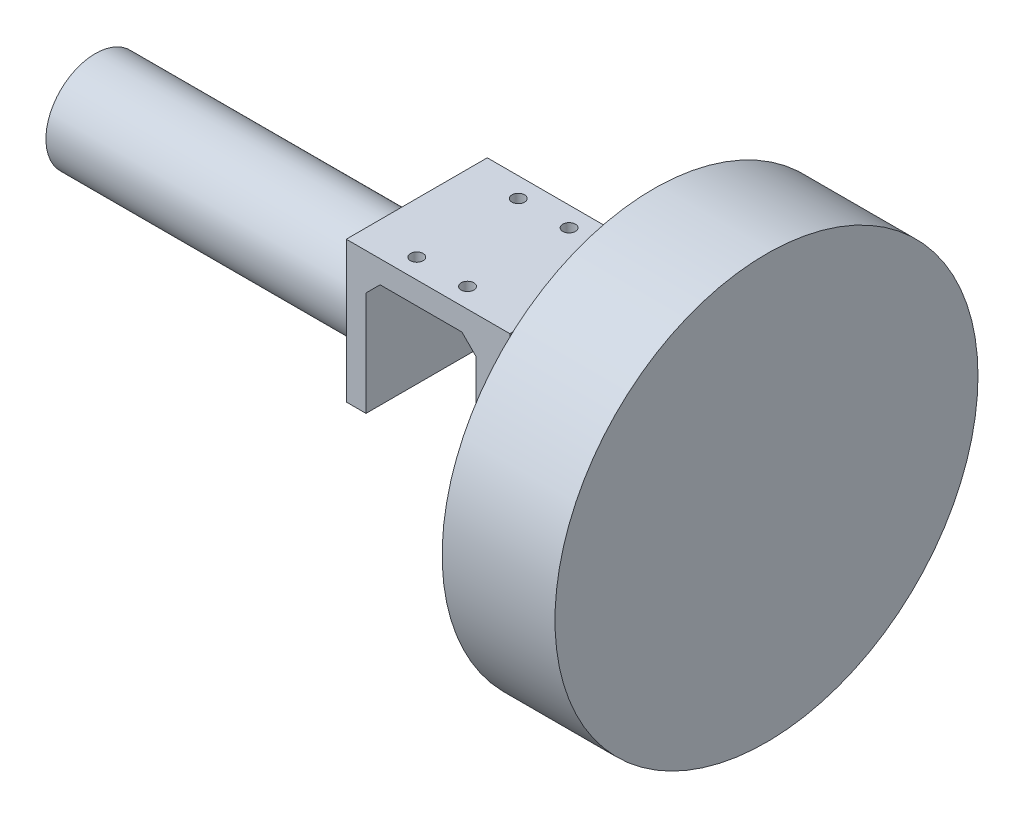
ISO-10303-21;
HEADER;
FILE_DESCRIPTION(('STEP AP214'),'2;1');
FILE_NAME('part.step','',(''),(''),'','','');
FILE_SCHEMA(('AUTOMOTIVE_DESIGN { 1 0 10303 214 1 1 1 1 }'));
ENDSEC;
DATA;
#1=APPLICATION_CONTEXT('core data for automotive mechanical design processes');
#2=APPLICATION_PROTOCOL_DEFINITION('international standard','automotive_design',2000,#1);
#3=PRODUCT_CONTEXT('',#1,'mechanical');
#4=PRODUCT('Part','Part','',(#3));
#5=PRODUCT_RELATED_PRODUCT_CATEGORY('part','',(#4));
#6=PRODUCT_DEFINITION_FORMATION('','',#4);
#7=PRODUCT_DEFINITION_CONTEXT('part definition',#1,'design');
#8=PRODUCT_DEFINITION('design','',#6,#7);
#9=PRODUCT_DEFINITION_SHAPE('','',#8);
#10=(LENGTH_UNIT() NAMED_UNIT(*) SI_UNIT(.MILLI.,.METRE.));
#11=(NAMED_UNIT(*) PLANE_ANGLE_UNIT() SI_UNIT($,.RADIAN.));
#12=(NAMED_UNIT(*) SI_UNIT($,.STERADIAN.) SOLID_ANGLE_UNIT());
#13=UNCERTAINTY_MEASURE_WITH_UNIT(LENGTH_MEASURE(1.E-05),#10,'distance_accuracy_value','');
#14=(GEOMETRIC_REPRESENTATION_CONTEXT(3) GLOBAL_UNCERTAINTY_ASSIGNED_CONTEXT((#13)) GLOBAL_UNIT_ASSIGNED_CONTEXT((#10,
#11,#12)) REPRESENTATION_CONTEXT('',''));
#15=CARTESIAN_POINT('',(0.,0.,0.));
#16=DIRECTION('',(0.,0.,1.));
#17=DIRECTION('',(1.,0.,0.));
#18=AXIS2_PLACEMENT_3D('',#15,#16,#17);
#19=CARTESIAN_POINT('',(20.,0.,0.));
#20=DIRECTION('',(-1.,0.,0.));
#21=DIRECTION('',(0.,0.,1.));
#22=AXIS2_PLACEMENT_3D('',#19,#20,#21);
#23=CYLINDRICAL_SURFACE('',#22,75.);
#24=CARTESIAN_POINT('',(20.,0.,0.));
#25=DIRECTION('',(1.,0.,0.));
#26=DIRECTION('',(0.,0.,-1.));
#27=AXIS2_PLACEMENT_3D('',#24,#25,#26);
#28=CIRCLE('',#27,75.);
#29=CARTESIAN_POINT('',(20.,0.,-75.));
#30=VERTEX_POINT('',#29);
#31=EDGE_CURVE('E169',#30,#30,#28,.T.);
#32=ORIENTED_EDGE('',*,*,#31,.F.);
#33=EDGE_LOOP('',(#32));
#34=FACE_BOUND('',#33,.T.);
#35=CARTESIAN_POINT('',(-20.,0.,0.));
#36=DIRECTION('',(1.,0.,0.));
#37=DIRECTION('',(0.,0.,-1.));
#38=AXIS2_PLACEMENT_3D('',#35,#36,#37);
#39=CIRCLE('',#38,75.);
#40=CARTESIAN_POINT('',(-20.,0.,-75.));
#41=VERTEX_POINT('',#40);
#42=EDGE_CURVE('E167',#41,#41,#39,.T.);
#43=ORIENTED_EDGE('',*,*,#42,.T.);
#44=EDGE_LOOP('',(#43));
#45=FACE_BOUND('',#44,.T.);
#46=ADVANCED_FACE('F43',(#34,#45),#23,.T.);
#47=CARTESIAN_POINT('',(20.,0.,0.));
#48=DIRECTION('',(1.,0.,0.));
#49=DIRECTION('',(0.,0.,-1.));
#50=AXIS2_PLACEMENT_3D('',#47,#48,#49);
#51=PLANE('',#50);
#52=ORIENTED_EDGE('',*,*,#31,.T.);
#53=EDGE_LOOP('',(#52));
#54=FACE_BOUND('',#53,.T.);
#55=ADVANCED_FACE('F291',(#54),#51,.T.);
#56=CARTESIAN_POINT('',(-20.,0.,0.));
#57=DIRECTION('',(1.,0.,0.));
#58=DIRECTION('',(0.,0.,-1.));
#59=AXIS2_PLACEMENT_3D('',#56,#57,#58);
#60=PLANE('',#59);
#61=CARTESIAN_POINT('',(-20.,0.,0.));
#62=DIRECTION('',(-1.,0.,0.));
#63=DIRECTION('',(0.,0.,1.));
#64=AXIS2_PLACEMENT_3D('',#61,#62,#63);
#65=CIRCLE('',#64,14.);
#66=CARTESIAN_POINT('',(-20.,0.,14.));
#67=VERTEX_POINT('',#66);
#68=EDGE_CURVE('E162',#67,#67,#65,.T.);
#69=ORIENTED_EDGE('',*,*,#68,.F.);
#70=EDGE_LOOP('',(#69));
#71=FACE_BOUND('',#70,.T.);
#72=ORIENTED_EDGE('',*,*,#42,.F.);
#73=EDGE_LOOP('',(#72));
#74=FACE_BOUND('',#73,.T.);
#75=ADVANCED_FACE('F303',(#71,#74),#60,.F.);
#76=CARTESIAN_POINT('',(-40.,0.,0.));
#77=DIRECTION('',(1.,0.,0.));
#78=DIRECTION('',(0.,0.,-1.));
#79=AXIS2_PLACEMENT_3D('',#76,#77,#78);
#80=CYLINDRICAL_SURFACE('',#79,14.);
#81=CARTESIAN_POINT('',(-40.,0.,0.));
#82=DIRECTION('',(-1.,0.,0.));
#83=DIRECTION('',(0.,0.,1.));
#84=AXIS2_PLACEMENT_3D('',#81,#82,#83);
#85=CIRCLE('',#84,14.);
#86=CARTESIAN_POINT('',(-40.,0.,14.));
#87=VERTEX_POINT('',#86);
#88=EDGE_CURVE('E152',#87,#87,#85,.T.);
#89=ORIENTED_EDGE('',*,*,#88,.F.);
#90=EDGE_LOOP('',(#89));
#91=FACE_BOUND('',#90,.T.);
#92=ORIENTED_EDGE('',*,*,#68,.T.);
#93=EDGE_LOOP('',(#92));
#94=FACE_BOUND('',#93,.T.);
#95=ADVANCED_FACE('F483',(#91,#94),#80,.T.);
#96=CARTESIAN_POINT('',(-40.,0.,0.));
#97=DIRECTION('',(-1.,0.,0.));
#98=DIRECTION('',(0.,0.,1.));
#99=AXIS2_PLACEMENT_3D('',#96,#97,#98);
#100=PLANE('',#99);
#101=CARTESIAN_POINT('',(-40.,0.,0.));
#102=DIRECTION('',(-1.,0.,0.));
#103=DIRECTION('',(0.,0.,1.));
#104=AXIS2_PLACEMENT_3D('',#101,#102,#103);
#105=CIRCLE('',#104,7.);
#106=CARTESIAN_POINT('',(-40.,0.,7.));
#107=VERTEX_POINT('',#106);
#108=EDGE_CURVE('E159',#107,#107,#105,.T.);
#109=ORIENTED_EDGE('',*,*,#108,.F.);
#110=EDGE_LOOP('',(#109));
#111=FACE_BOUND('',#110,.T.);
#112=ORIENTED_EDGE('',*,*,#88,.T.);
#113=EDGE_LOOP('',(#112));
#114=FACE_BOUND('',#113,.T.);
#115=ADVANCED_FACE('F475',(#111,#114),#100,.T.);
#116=CARTESIAN_POINT('',(-46.,0.,0.));
#117=DIRECTION('',(1.,0.,0.));
#118=DIRECTION('',(0.,0.,-1.));
#119=AXIS2_PLACEMENT_3D('',#116,#117,#118);
#120=CYLINDRICAL_SURFACE('',#119,7.);
#121=CARTESIAN_POINT('',(-46.,0.,0.));
#122=DIRECTION('',(-1.,0.,0.));
#123=DIRECTION('',(0.,0.,1.));
#124=AXIS2_PLACEMENT_3D('',#121,#122,#123);
#125=CIRCLE('',#124,7.);
#126=CARTESIAN_POINT('',(-46.,0.,7.));
#127=VERTEX_POINT('',#126);
#128=EDGE_CURVE('E149',#127,#127,#125,.T.);
#129=ORIENTED_EDGE('',*,*,#128,.F.);
#130=EDGE_LOOP('',(#129));
#131=FACE_BOUND('',#130,.T.);
#132=ORIENTED_EDGE('',*,*,#108,.T.);
#133=EDGE_LOOP('',(#132));
#134=FACE_BOUND('',#133,.T.);
#135=ADVANCED_FACE('F465',(#131,#134),#120,.T.);
#136=CARTESIAN_POINT('',(-58.,-20.,25.));
#137=DIRECTION('',(0.,1.,0.));
#138=DIRECTION('',(-1.,0.,0.));
#139=AXIS2_PLACEMENT_3D('',#136,#137,#138);
#140=PLANE('',#139);
#141=DIRECTION('',(1.,0.,0.));
#142=VECTOR('',#141,1.);
#143=CARTESIAN_POINT('',(-58.,-20.,-25.));
#144=LINE('',#143,#142);
#145=CARTESIAN_POINT('',(-58.,-20.,-25.));
#146=VERTEX_POINT('',#145);
#147=CARTESIAN_POINT('',(-46.,-20.,-25.));
#148=VERTEX_POINT('',#147);
#149=EDGE_CURVE('E147',#146,#148,#144,.T.);
#150=ORIENTED_EDGE('',*,*,#149,.T.);
#151=DIRECTION('',(0.,0.,-1.));
#152=VECTOR('',#151,1.);
#153=CARTESIAN_POINT('',(-46.,-20.,25.));
#154=LINE('',#153,#152);
#155=CARTESIAN_POINT('',(-46.,-20.,25.));
#156=VERTEX_POINT('',#155);
#157=EDGE_CURVE('E128',#156,#148,#154,.T.);
#158=ORIENTED_EDGE('',*,*,#157,.F.);
#159=DIRECTION('',(1.,0.,0.));
#160=VECTOR('',#159,1.);
#161=CARTESIAN_POINT('',(-58.,-20.,25.));
#162=LINE('',#161,#160);
#163=CARTESIAN_POINT('',(-58.,-20.,25.));
#164=VERTEX_POINT('',#163);
#165=EDGE_CURVE('E138',#164,#156,#162,.T.);
#166=ORIENTED_EDGE('',*,*,#165,.F.);
#167=DIRECTION('',(0.,0.,-1.));
#168=VECTOR('',#167,1.);
#169=CARTESIAN_POINT('',(-58.,-20.,25.));
#170=LINE('',#169,#168);
#171=EDGE_CURVE('E228',#164,#146,#170,.T.);
#172=ORIENTED_EDGE('',*,*,#171,.T.);
#173=EDGE_LOOP('',(#150,#158,#166,#172));
#174=FACE_BOUND('',#173,.T.);
#175=ADVANCED_FACE('F150',(#174),#140,.F.);
#176=CARTESIAN_POINT('',(-46.,-20.,25.));
#177=DIRECTION('',(-1.,0.,0.));
#178=DIRECTION('',(0.,0.,1.));
#179=AXIS2_PLACEMENT_3D('',#176,#177,#178);
#180=PLANE('',#179);
#181=ORIENTED_EDGE('',*,*,#128,.T.);
#182=EDGE_LOOP('',(#181));
#183=FACE_BOUND('',#182,.T.);
#184=DIRECTION('',(0.,1.,0.));
#185=VECTOR('',#184,1.);
#186=CARTESIAN_POINT('',(-46.,-20.,-25.));
#187=LINE('',#186,#185);
#188=CARTESIAN_POINT('',(-46.,30.,-25.));
#189=VERTEX_POINT('',#188);
#190=EDGE_CURVE('E227',#148,#189,#187,.T.);
#191=ORIENTED_EDGE('',*,*,#190,.T.);
#192=DIRECTION('',(0.,0.,-1.));
#193=VECTOR('',#192,1.);
#194=CARTESIAN_POINT('',(-46.,30.,25.));
#195=LINE('',#194,#193);
#196=CARTESIAN_POINT('',(-46.,30.,25.));
#197=VERTEX_POINT('',#196);
#198=EDGE_CURVE('E135',#197,#189,#195,.T.);
#199=ORIENTED_EDGE('',*,*,#198,.F.);
#200=DIRECTION('',(0.,1.,0.));
#201=VECTOR('',#200,1.);
#202=CARTESIAN_POINT('',(-46.,-20.,25.));
#203=LINE('',#202,#201);
#204=EDGE_CURVE('E124',#156,#197,#203,.T.);
#205=ORIENTED_EDGE('',*,*,#204,.F.);
#206=ORIENTED_EDGE('',*,*,#157,.T.);
#207=EDGE_LOOP('',(#191,#199,#205,#206));
#208=FACE_BOUND('',#207,.T.);
#209=ADVANCED_FACE('F130',(#183,#208),#180,.F.);
#210=CARTESIAN_POINT('',(-46.,30.,25.));
#211=DIRECTION('',(0.,-1.,0.));
#212=DIRECTION('',(1.,0.,0.));
#213=AXIS2_PLACEMENT_3D('',#210,#211,#212);
#214=PLANE('',#213);
#215=CARTESIAN_POINT('',(-68.,30.,-18.));
#216=DIRECTION('',(0.,1.,0.));
#217=DIRECTION('',(0.,0.,1.));
#218=AXIS2_PLACEMENT_3D('',#215,#216,#217);
#219=CIRCLE('',#218,2.24999999999999);
#220=CARTESIAN_POINT('',(-68.,30.,-15.75));
#221=VERTEX_POINT('',#220);
#222=EDGE_CURVE('E203',#221,#221,#219,.T.);
#223=ORIENTED_EDGE('',*,*,#222,.F.);
#224=EDGE_LOOP('',(#223));
#225=FACE_BOUND('',#224,.T.);
#226=CARTESIAN_POINT('',(-86.,30.,-18.));
#227=DIRECTION('',(0.,1.,0.));
#228=DIRECTION('',(0.,0.,1.));
#229=AXIS2_PLACEMENT_3D('',#226,#227,#228);
#230=CIRCLE('',#229,2.24999999999999);
#231=CARTESIAN_POINT('',(-86.,30.,-15.75));
#232=VERTEX_POINT('',#231);
#233=EDGE_CURVE('E192',#232,#232,#230,.T.);
#234=ORIENTED_EDGE('',*,*,#233,.F.);
#235=EDGE_LOOP('',(#234));
#236=FACE_BOUND('',#235,.T.);
#237=CARTESIAN_POINT('',(-68.,30.,18.));
#238=DIRECTION('',(0.,1.,0.));
#239=DIRECTION('',(0.,0.,1.));
#240=AXIS2_PLACEMENT_3D('',#237,#238,#239);
#241=CIRCLE('',#240,2.24999999999999);
#242=CARTESIAN_POINT('',(-68.,30.,20.25));
#243=VERTEX_POINT('',#242);
#244=EDGE_CURVE('E191',#243,#243,#241,.T.);
#245=ORIENTED_EDGE('',*,*,#244,.F.);
#246=EDGE_LOOP('',(#245));
#247=FACE_BOUND('',#246,.T.);
#248=CARTESIAN_POINT('',(-86.,30.,18.));
#249=DIRECTION('',(0.,1.,0.));
#250=DIRECTION('',(0.,0.,1.));
#251=AXIS2_PLACEMENT_3D('',#248,#249,#250);
#252=CIRCLE('',#251,2.24999999999999);
#253=CARTESIAN_POINT('',(-86.,30.,20.25));
#254=VERTEX_POINT('',#253);
#255=EDGE_CURVE('E187',#254,#254,#252,.T.);
#256=ORIENTED_EDGE('',*,*,#255,.F.);
#257=EDGE_LOOP('',(#256));
#258=FACE_BOUND('',#257,.T.);
#259=DIRECTION('',(-1.,0.,0.));
#260=VECTOR('',#259,1.);
#261=CARTESIAN_POINT('',(-46.,30.,-25.));
#262=LINE('',#261,#260);
#263=CARTESIAN_POINT('',(-104.,30.,-25.));
#264=VERTEX_POINT('',#263);
#265=EDGE_CURVE('E226',#189,#264,#262,.T.);
#266=ORIENTED_EDGE('',*,*,#265,.T.);
#267=DIRECTION('',(0.,0.,-1.));
#268=VECTOR('',#267,1.);
#269=CARTESIAN_POINT('',(-104.,30.,25.));
#270=LINE('',#269,#268);
#271=CARTESIAN_POINT('',(-104.,30.,25.));
#272=VERTEX_POINT('',#271);
#273=EDGE_CURVE('E151',#272,#264,#270,.T.);
#274=ORIENTED_EDGE('',*,*,#273,.F.);
#275=DIRECTION('',(-1.,0.,0.));
#276=VECTOR('',#275,1.);
#277=CARTESIAN_POINT('',(-46.,30.,25.));
#278=LINE('',#277,#276);
#279=EDGE_CURVE('E133',#197,#272,#278,.T.);
#280=ORIENTED_EDGE('',*,*,#279,.F.);
#281=ORIENTED_EDGE('',*,*,#198,.T.);
#282=EDGE_LOOP('',(#266,#274,#280,#281));
#283=FACE_BOUND('',#282,.T.);
#284=ADVANCED_FACE('F277',(#225,#236,#247,#258,#283),#214,.F.);
#285=CARTESIAN_POINT('',(-104.,30.,25.));
#286=DIRECTION('',(1.,0.,0.));
#287=DIRECTION('',(0.,0.,-1.));
#288=AXIS2_PLACEMENT_3D('',#285,#286,#287);
#289=PLANE('',#288);
#290=CARTESIAN_POINT('',(-104.,0.,0.));
#291=DIRECTION('',(-1.,0.,0.));
#292=DIRECTION('',(0.,0.,1.));
#293=AXIS2_PLACEMENT_3D('',#290,#291,#292);
#294=CIRCLE('',#293,17.5);
#295=CARTESIAN_POINT('',(-104.,0.,-17.5));
#296=VERTEX_POINT('',#295);
#297=EDGE_CURVE('E11',#296,#296,#294,.T.);
#298=ORIENTED_EDGE('',*,*,#297,.F.);
#299=EDGE_LOOP('',(#298));
#300=FACE_BOUND('',#299,.T.);
#301=DIRECTION('',(0.,-1.,0.));
#302=VECTOR('',#301,1.);
#303=CARTESIAN_POINT('',(-104.,30.,-25.));
#304=LINE('',#303,#302);
#305=CARTESIAN_POINT('',(-104.,-20.,-25.));
#306=VERTEX_POINT('',#305);
#307=EDGE_CURVE('E235',#264,#306,#304,.T.);
#308=ORIENTED_EDGE('',*,*,#307,.T.);
#309=DIRECTION('',(0.,0.,-1.));
#310=VECTOR('',#309,1.);
#311=CARTESIAN_POINT('',(-104.,-20.,25.));
#312=LINE('',#311,#310);
#313=CARTESIAN_POINT('',(-104.,-20.,25.));
#314=VERTEX_POINT('',#313);
#315=EDGE_CURVE('E248',#314,#306,#312,.T.);
#316=ORIENTED_EDGE('',*,*,#315,.F.);
#317=DIRECTION('',(0.,-1.,0.));
#318=VECTOR('',#317,1.);
#319=CARTESIAN_POINT('',(-104.,30.,25.));
#320=LINE('',#319,#318);
#321=EDGE_CURVE('E217',#272,#314,#320,.T.);
#322=ORIENTED_EDGE('',*,*,#321,.F.);
#323=ORIENTED_EDGE('',*,*,#273,.T.);
#324=EDGE_LOOP('',(#308,#316,#322,#323));
#325=FACE_BOUND('',#324,.T.);
#326=ADVANCED_FACE('F252',(#300,#325),#289,.F.);
#327=CARTESIAN_POINT('',(-104.,-20.,25.));
#328=DIRECTION('',(0.,1.,0.));
#329=DIRECTION('',(-1.,0.,0.));
#330=AXIS2_PLACEMENT_3D('',#327,#328,#329);
#331=PLANE('',#330);
#332=DIRECTION('',(1.,0.,0.));
#333=VECTOR('',#332,1.);
#334=CARTESIAN_POINT('',(-104.,-20.,-25.));
#335=LINE('',#334,#333);
#336=CARTESIAN_POINT('',(-97.,-20.,-25.));
#337=VERTEX_POINT('',#336);
#338=EDGE_CURVE('E234',#306,#337,#335,.T.);
#339=ORIENTED_EDGE('',*,*,#338,.T.);
#340=DIRECTION('',(0.,0.,-1.));
#341=VECTOR('',#340,1.);
#342=CARTESIAN_POINT('',(-97.,-20.,25.));
#343=LINE('',#342,#341);
#344=CARTESIAN_POINT('',(-97.,-20.,25.));
#345=VERTEX_POINT('',#344);
#346=EDGE_CURVE('E243',#345,#337,#343,.T.);
#347=ORIENTED_EDGE('',*,*,#346,.F.);
#348=DIRECTION('',(1.,0.,0.));
#349=VECTOR('',#348,1.);
#350=CARTESIAN_POINT('',(-104.,-20.,25.));
#351=LINE('',#350,#349);
#352=EDGE_CURVE('E218',#314,#345,#351,.T.);
#353=ORIENTED_EDGE('',*,*,#352,.F.);
#354=ORIENTED_EDGE('',*,*,#315,.T.);
#355=EDGE_LOOP('',(#339,#347,#353,#354));
#356=FACE_BOUND('',#355,.T.);
#357=ADVANCED_FACE('F263',(#356),#331,.F.);
#358=CARTESIAN_POINT('',(-97.,-20.,25.));
#359=DIRECTION('',(-1.,0.,0.));
#360=DIRECTION('',(0.,0.,1.));
#361=AXIS2_PLACEMENT_3D('',#358,#359,#360);
#362=PLANE('',#361);
#363=DIRECTION('',(0.,1.,0.));
#364=VECTOR('',#363,1.);
#365=CARTESIAN_POINT('',(-97.,-20.,-25.));
#366=LINE('',#365,#364);
#367=CARTESIAN_POINT('',(-97.,17.,-25.));
#368=VERTEX_POINT('',#367);
#369=EDGE_CURVE('E238',#337,#368,#366,.T.);
#370=ORIENTED_EDGE('',*,*,#369,.T.);
#371=DIRECTION('',(0.,0.,1.));
#372=VECTOR('',#371,1.);
#373=CARTESIAN_POINT('',(-97.,17.,25.));
#374=LINE('',#373,#372);
#375=CARTESIAN_POINT('',(-97.,17.,25.));
#376=VERTEX_POINT('',#375);
#377=EDGE_CURVE('E63',#368,#376,#374,.T.);
#378=ORIENTED_EDGE('',*,*,#377,.T.);
#379=DIRECTION('',(0.,1.,0.));
#380=VECTOR('',#379,1.);
#381=CARTESIAN_POINT('',(-97.,-20.,25.));
#382=LINE('',#381,#380);
#383=EDGE_CURVE('E216',#345,#376,#382,.T.);
#384=ORIENTED_EDGE('',*,*,#383,.F.);
#385=ORIENTED_EDGE('',*,*,#346,.T.);
#386=EDGE_LOOP('',(#370,#378,#384,#385));
#387=FACE_BOUND('',#386,.T.);
#388=ADVANCED_FACE('F261',(#387),#362,.F.);
#389=CARTESIAN_POINT('',(-97.,22.,25.));
#390=DIRECTION('',(0.,1.,0.));
#391=DIRECTION('',(-1.,0.,0.));
#392=AXIS2_PLACEMENT_3D('',#389,#390,#391);
#393=PLANE('',#392);
#394=CARTESIAN_POINT('',(-68.,22.,-18.));
#395=DIRECTION('',(0.,1.,0.));
#396=DIRECTION('',(-1.,0.,0.));
#397=AXIS2_PLACEMENT_3D('',#394,#395,#396);
#398=CIRCLE('',#397,2.24999999999999);
#399=CARTESIAN_POINT('',(-70.25,22.,-18.));
#400=VERTEX_POINT('',#399);
#401=EDGE_CURVE('E48',#400,#400,#398,.T.);
#402=ORIENTED_EDGE('',*,*,#401,.T.);
#403=EDGE_LOOP('',(#402));
#404=FACE_BOUND('',#403,.T.);
#405=CARTESIAN_POINT('',(-86.,22.,-18.));
#406=DIRECTION('',(0.,1.,0.));
#407=DIRECTION('',(-1.,0.,0.));
#408=AXIS2_PLACEMENT_3D('',#405,#406,#407);
#409=CIRCLE('',#408,2.24999999999999);
#410=CARTESIAN_POINT('',(-88.25,22.,-18.));
#411=VERTEX_POINT('',#410);
#412=EDGE_CURVE('E195',#411,#411,#409,.T.);
#413=ORIENTED_EDGE('',*,*,#412,.T.);
#414=EDGE_LOOP('',(#413));
#415=FACE_BOUND('',#414,.T.);
#416=CARTESIAN_POINT('',(-68.,22.,18.));
#417=DIRECTION('',(0.,1.,0.));
#418=DIRECTION('',(-1.,0.,0.));
#419=AXIS2_PLACEMENT_3D('',#416,#417,#418);
#420=CIRCLE('',#419,2.24999999999999);
#421=CARTESIAN_POINT('',(-70.25,22.,18.));
#422=VERTEX_POINT('',#421);
#423=EDGE_CURVE('E186',#422,#422,#420,.T.);
#424=ORIENTED_EDGE('',*,*,#423,.T.);
#425=EDGE_LOOP('',(#424));
#426=FACE_BOUND('',#425,.T.);
#427=CARTESIAN_POINT('',(-86.,22.,18.));
#428=DIRECTION('',(0.,1.,0.));
#429=DIRECTION('',(-1.,0.,0.));
#430=AXIS2_PLACEMENT_3D('',#427,#428,#429);
#431=CIRCLE('',#430,2.24999999999999);
#432=CARTESIAN_POINT('',(-88.25,22.,18.));
#433=VERTEX_POINT('',#432);
#434=EDGE_CURVE('E206',#433,#433,#431,.T.);
#435=ORIENTED_EDGE('',*,*,#434,.T.);
#436=EDGE_LOOP('',(#435));
#437=FACE_BOUND('',#436,.T.);
#438=DIRECTION('',(1.,0.,0.));
#439=VECTOR('',#438,1.);
#440=CARTESIAN_POINT('',(-97.,22.,-25.));
#441=LINE('',#440,#439);
#442=CARTESIAN_POINT('',(-92.,22.,-25.));
#443=VERTEX_POINT('',#442);
#444=CARTESIAN_POINT('',(-63.,22.,-25.));
#445=VERTEX_POINT('',#444);
#446=EDGE_CURVE('E237',#443,#445,#441,.T.);
#447=ORIENTED_EDGE('',*,*,#446,.T.);
#448=DIRECTION('',(0.,0.,1.));
#449=VECTOR('',#448,1.);
#450=CARTESIAN_POINT('',(-63.,22.,25.));
#451=LINE('',#450,#449);
#452=CARTESIAN_POINT('',(-63.,22.,25.));
#453=VERTEX_POINT('',#452);
#454=EDGE_CURVE('E180',#445,#453,#451,.T.);
#455=ORIENTED_EDGE('',*,*,#454,.T.);
#456=DIRECTION('',(1.,0.,0.));
#457=VECTOR('',#456,1.);
#458=CARTESIAN_POINT('',(-97.,22.,25.));
#459=LINE('',#458,#457);
#460=CARTESIAN_POINT('',(-92.,22.,25.));
#461=VERTEX_POINT('',#460);
#462=EDGE_CURVE('E225',#461,#453,#459,.T.);
#463=ORIENTED_EDGE('',*,*,#462,.F.);
#464=DIRECTION('',(0.,0.,-1.));
#465=VECTOR('',#464,1.);
#466=CARTESIAN_POINT('',(-92.,22.,-25.));
#467=LINE('',#466,#465);
#468=EDGE_CURVE('E178',#461,#443,#467,.T.);
#469=ORIENTED_EDGE('',*,*,#468,.T.);
#470=EDGE_LOOP('',(#447,#455,#463,#469));
#471=FACE_BOUND('',#470,.T.);
#472=ADVANCED_FACE('F267',(#404,#415,#426,#437,#471),#393,.F.);
#473=CARTESIAN_POINT('',(-58.,22.,25.));
#474=DIRECTION('',(1.,0.,0.));
#475=DIRECTION('',(0.,0.,-1.));
#476=AXIS2_PLACEMENT_3D('',#473,#474,#475);
#477=PLANE('',#476);
#478=DIRECTION('',(0.,-1.,0.));
#479=VECTOR('',#478,1.);
#480=CARTESIAN_POINT('',(-58.,22.,25.));
#481=LINE('',#480,#479);
#482=CARTESIAN_POINT('',(-58.,17.,25.));
#483=VERTEX_POINT('',#482);
#484=EDGE_CURVE('E142',#483,#164,#481,.T.);
#485=ORIENTED_EDGE('',*,*,#484,.F.);
#486=DIRECTION('',(0.,0.,-1.));
#487=VECTOR('',#486,1.);
#488=CARTESIAN_POINT('',(-58.,17.,-25.));
#489=LINE('',#488,#487);
#490=CARTESIAN_POINT('',(-58.,17.,-25.));
#491=VERTEX_POINT('',#490);
#492=EDGE_CURVE('E164',#483,#491,#489,.T.);
#493=ORIENTED_EDGE('',*,*,#492,.T.);
#494=DIRECTION('',(0.,-1.,0.));
#495=VECTOR('',#494,1.);
#496=CARTESIAN_POINT('',(-58.,22.,-25.));
#497=LINE('',#496,#495);
#498=EDGE_CURVE('E141',#491,#146,#497,.T.);
#499=ORIENTED_EDGE('',*,*,#498,.T.);
#500=ORIENTED_EDGE('',*,*,#171,.F.);
#501=EDGE_LOOP('',(#485,#493,#499,#500));
#502=FACE_BOUND('',#501,.T.);
#503=ADVANCED_FACE('F280',(#502),#477,.F.);
#504=CARTESIAN_POINT('',(0.,0.,25.));
#505=DIRECTION('',(0.,0.,1.));
#506=DIRECTION('',(1.,0.,0.));
#507=AXIS2_PLACEMENT_3D('',#504,#505,#506);
#508=PLANE('',#507);
#509=ORIENTED_EDGE('',*,*,#165,.T.);
#510=ORIENTED_EDGE('',*,*,#204,.T.);
#511=ORIENTED_EDGE('',*,*,#279,.T.);
#512=ORIENTED_EDGE('',*,*,#321,.T.);
#513=ORIENTED_EDGE('',*,*,#352,.T.);
#514=ORIENTED_EDGE('',*,*,#383,.T.);
#515=DIRECTION('',(-0.707106781186549,-0.707106781186546,0.));
#516=VECTOR('',#515,1.);
#517=CARTESIAN_POINT('',(-92.,22.,25.));
#518=LINE('',#517,#516);
#519=EDGE_CURVE('E52',#376,#461,#518,.F.);
#520=ORIENTED_EDGE('',*,*,#519,.T.);
#521=ORIENTED_EDGE('',*,*,#462,.T.);
#522=DIRECTION('',(-0.707106781186546,0.707106781186549,0.));
#523=VECTOR('',#522,1.);
#524=CARTESIAN_POINT('',(-58.,17.,25.));
#525=LINE('',#524,#523);
#526=EDGE_CURVE('E185',#453,#483,#525,.F.);
#527=ORIENTED_EDGE('',*,*,#526,.T.);
#528=ORIENTED_EDGE('',*,*,#484,.T.);
#529=EDGE_LOOP('',(#509,#510,#511,#512,#513,#514,#520,#521,#527,#528));
#530=FACE_BOUND('',#529,.T.);
#531=ADVANCED_FACE('F140',(#530),#508,.T.);
#532=CARTESIAN_POINT('',(0.,0.,-25.));
#533=DIRECTION('',(0.,0.,1.));
#534=DIRECTION('',(1.,0.,0.));
#535=AXIS2_PLACEMENT_3D('',#532,#533,#534);
#536=PLANE('',#535);
#537=ORIENTED_EDGE('',*,*,#149,.F.);
#538=ORIENTED_EDGE('',*,*,#498,.F.);
#539=DIRECTION('',(0.707106781186546,-0.707106781186549,0.));
#540=VECTOR('',#539,1.);
#541=CARTESIAN_POINT('',(-20.5000000000002,-20.5000000000001,-25.));
#542=LINE('',#541,#540);
#543=EDGE_CURVE('E182',#491,#445,#542,.F.);
#544=ORIENTED_EDGE('',*,*,#543,.T.);
#545=ORIENTED_EDGE('',*,*,#446,.F.);
#546=DIRECTION('',(0.707106781186549,0.707106781186546,0.));
#547=VECTOR('',#546,1.);
#548=CARTESIAN_POINT('',(-56.9999999999997,57.,-25.));
#549=LINE('',#548,#547);
#550=EDGE_CURVE('E69',#443,#368,#549,.F.);
#551=ORIENTED_EDGE('',*,*,#550,.T.);
#552=ORIENTED_EDGE('',*,*,#369,.F.);
#553=ORIENTED_EDGE('',*,*,#338,.F.);
#554=ORIENTED_EDGE('',*,*,#307,.F.);
#555=ORIENTED_EDGE('',*,*,#265,.F.);
#556=ORIENTED_EDGE('',*,*,#190,.F.);
#557=EDGE_LOOP('',(#537,#538,#544,#545,#551,#552,#553,#554,#555,#556));
#558=FACE_BOUND('',#557,.T.);
#559=ADVANCED_FACE('F256',(#558),#536,.F.);
#560=CARTESIAN_POINT('',(-58.,17.,25.));
#561=DIRECTION('',(-0.707106781186549,-0.707106781186545,0.));
#562=DIRECTION('',(0.,0.,1.));
#563=AXIS2_PLACEMENT_3D('',#560,#561,#562);
#564=PLANE('',#563);
#565=ORIENTED_EDGE('',*,*,#526,.F.);
#566=ORIENTED_EDGE('',*,*,#454,.F.);
#567=ORIENTED_EDGE('',*,*,#543,.F.);
#568=ORIENTED_EDGE('',*,*,#492,.F.);
#569=EDGE_LOOP('',(#565,#566,#567,#568));
#570=FACE_BOUND('',#569,.T.);
#571=ADVANCED_FACE('F274',(#570),#564,.T.);
#572=CARTESIAN_POINT('',(-92.,22.,25.));
#573=DIRECTION('',(0.707106781186545,-0.707106781186549,0.));
#574=DIRECTION('',(0.,0.,1.));
#575=AXIS2_PLACEMENT_3D('',#572,#573,#574);
#576=PLANE('',#575);
#577=ORIENTED_EDGE('',*,*,#519,.F.);
#578=ORIENTED_EDGE('',*,*,#377,.F.);
#579=ORIENTED_EDGE('',*,*,#550,.F.);
#580=ORIENTED_EDGE('',*,*,#468,.F.);
#581=EDGE_LOOP('',(#577,#578,#579,#580));
#582=FACE_BOUND('',#581,.T.);
#583=ADVANCED_FACE('F46',(#582),#576,.T.);
#584=CARTESIAN_POINT('',(-218.,0.,0.));
#585=DIRECTION('',(1.,0.,0.));
#586=DIRECTION('',(0.,0.,-1.));
#587=AXIS2_PLACEMENT_3D('',#584,#585,#586);
#588=CYLINDRICAL_SURFACE('',#587,17.5);
#589=CARTESIAN_POINT('',(-218.,0.,0.));
#590=DIRECTION('',(-1.,0.,0.));
#591=DIRECTION('',(0.,0.,1.));
#592=AXIS2_PLACEMENT_3D('',#589,#590,#591);
#593=CIRCLE('',#592,17.5);
#594=CARTESIAN_POINT('',(-218.,0.,-17.5));
#595=VERTEX_POINT('',#594);
#596=EDGE_CURVE('E214',#595,#595,#593,.T.);
#597=CARTESIAN_POINT('',(-218.,0.,-17.5));
#598=CARTESIAN_POINT('',(-216.8125,0.,-17.5));
#599=CARTESIAN_POINT('',(-215.625,0.,-17.5));
#600=CARTESIAN_POINT('',(-213.25,0.,-17.5));
#601=CARTESIAN_POINT('',(-212.0625,0.,-17.5));
#602=CARTESIAN_POINT('',(-209.6875,0.,-17.5));
#603=CARTESIAN_POINT('',(-208.5,0.,-17.5));
#604=CARTESIAN_POINT('',(-206.125,0.,-17.5));
#605=CARTESIAN_POINT('',(-204.9375,0.,-17.5));
#606=CARTESIAN_POINT('',(-202.5625,0.,-17.5));
#607=CARTESIAN_POINT('',(-201.375,0.,-17.5));
#608=CARTESIAN_POINT('',(-199.,0.,-17.5));
#609=CARTESIAN_POINT('',(-197.8125,0.,-17.5));
#610=CARTESIAN_POINT('',(-195.4375,0.,-17.5));
#611=CARTESIAN_POINT('',(-194.25,0.,-17.5));
#612=CARTESIAN_POINT('',(-191.875,0.,-17.5));
#613=CARTESIAN_POINT('',(-190.6875,0.,-17.5));
#614=CARTESIAN_POINT('',(-188.3125,0.,-17.5));
#615=CARTESIAN_POINT('',(-187.125,0.,-17.5));
#616=CARTESIAN_POINT('',(-184.75,0.,-17.5));
#617=CARTESIAN_POINT('',(-183.5625,0.,-17.5));
#618=CARTESIAN_POINT('',(-181.1875,0.,-17.5));
#619=CARTESIAN_POINT('',(-180.,0.,-17.5));
#620=CARTESIAN_POINT('',(-177.625,0.,-17.5));
#621=CARTESIAN_POINT('',(-176.4375,0.,-17.5));
#622=CARTESIAN_POINT('',(-174.0625,0.,-17.5));
#623=CARTESIAN_POINT('',(-172.875,0.,-17.5));
#624=CARTESIAN_POINT('',(-170.5,0.,-17.5));
#625=CARTESIAN_POINT('',(-169.3125,0.,-17.5));
#626=CARTESIAN_POINT('',(-166.9375,0.,-17.5));
#627=CARTESIAN_POINT('',(-165.75,0.,-17.5));
#628=CARTESIAN_POINT('',(-163.375,0.,-17.5));
#629=CARTESIAN_POINT('',(-162.1875,0.,-17.5));
#630=CARTESIAN_POINT('',(-159.8125,0.,-17.5));
#631=CARTESIAN_POINT('',(-158.625,0.,-17.5));
#632=CARTESIAN_POINT('',(-156.25,0.,-17.5));
#633=CARTESIAN_POINT('',(-155.0625,0.,-17.5));
#634=CARTESIAN_POINT('',(-152.6875,0.,-17.5));
#635=CARTESIAN_POINT('',(-151.5,0.,-17.5));
#636=CARTESIAN_POINT('',(-149.125,0.,-17.5));
#637=CARTESIAN_POINT('',(-147.9375,0.,-17.5));
#638=CARTESIAN_POINT('',(-145.5625,0.,-17.5));
#639=CARTESIAN_POINT('',(-144.375,0.,-17.5));
#640=CARTESIAN_POINT('',(-142.,0.,-17.5));
#641=CARTESIAN_POINT('',(-140.8125,0.,-17.5));
#642=CARTESIAN_POINT('',(-138.4375,0.,-17.5));
#643=CARTESIAN_POINT('',(-137.25,0.,-17.5));
#644=CARTESIAN_POINT('',(-134.875,0.,-17.5));
#645=CARTESIAN_POINT('',(-133.6875,0.,-17.5));
#646=CARTESIAN_POINT('',(-131.3125,0.,-17.5));
#647=CARTESIAN_POINT('',(-130.125,0.,-17.5));
#648=CARTESIAN_POINT('',(-127.75,0.,-17.5));
#649=CARTESIAN_POINT('',(-126.5625,0.,-17.5));
#650=CARTESIAN_POINT('',(-124.1875,0.,-17.5));
#651=CARTESIAN_POINT('',(-123.,0.,-17.5));
#652=CARTESIAN_POINT('',(-120.625,0.,-17.5));
#653=CARTESIAN_POINT('',(-119.4375,0.,-17.5));
#654=CARTESIAN_POINT('',(-117.0625,0.,-17.5));
#655=CARTESIAN_POINT('',(-115.875,0.,-17.5));
#656=CARTESIAN_POINT('',(-113.5,0.,-17.5));
#657=CARTESIAN_POINT('',(-112.3125,0.,-17.5));
#658=CARTESIAN_POINT('',(-109.9375,0.,-17.5));
#659=CARTESIAN_POINT('',(-108.75,0.,-17.5));
#660=CARTESIAN_POINT('',(-106.375,0.,-17.5));
#661=CARTESIAN_POINT('',(-105.1875,0.,-17.5));
#662=CARTESIAN_POINT('',(-104.,0.,-17.5));
#663=B_SPLINE_CURVE_WITH_KNOTS('',3,(#597,#598,#599,#600,#601,#602,#603,#604,#605,#606,#607,
#608,#609,#610,#611,#612,#613,#614,#615,#616,#617,#618,#619,#620,#621,#622,#623,#624,#625,#626,
#627,#628,#629,#630,#631,#632,#633,#634,#635,#636,#637,#638,#639,#640,#641,#642,#643,#644,#645,
#646,#647,#648,#649,#650,#651,#652,#653,#654,#655,#656,#657,#658,#659,#660,#661,#662),
.UNSPECIFIED.,.F.,.F.,(4,2,2,2,2,2,2,2,2,2,2,2,2,2,2,2,2,2,2,2,2,2,2,2,2,2,2,2,2,2,2,2,4),(0.,
3.56250000000002,7.12500000000002,10.6875,14.25,17.8125,21.375,24.9375,28.5,32.0625,35.625,
39.1875,42.75,46.3125,49.875,53.4375,57.,60.5625,64.125,67.6875,71.25,74.8125,78.375,81.9375,
85.5,89.0625,92.625,96.1875,99.75,103.3125,106.875,110.4375,114.),.UNSPECIFIED.);
#664=EDGE_CURVE('BSEAM311',#595,#296,#663,.T.);
#665=ORIENTED_EDGE('',*,*,#596,.F.);
#666=ORIENTED_EDGE('',*,*,#297,.T.);
#667=ORIENTED_EDGE('',*,*,#664,.T.);
#668=ORIENTED_EDGE('',*,*,#664,.F.);
#669=EDGE_LOOP('',(#665,#667,#666,#668));
#670=FACE_BOUND('',#669,.T.);
#671=ADVANCED_FACE('F311',(#670),#588,.T.);
#672=CARTESIAN_POINT('',(-218.,0.,0.));
#673=DIRECTION('',(-1.,0.,0.));
#674=DIRECTION('',(0.,0.,1.));
#675=AXIS2_PLACEMENT_3D('',#672,#673,#674);
#676=PLANE('',#675);
#677=ORIENTED_EDGE('',*,*,#596,.T.);
#678=EDGE_LOOP('',(#677));
#679=FACE_BOUND('',#678,.T.);
#680=ADVANCED_FACE('F378',(#679),#676,.T.);
#681=CARTESIAN_POINT('',(-86.,30.,18.));
#682=DIRECTION('',(0.,1.,0.));
#683=DIRECTION('',(0.,0.,1.));
#684=AXIS2_PLACEMENT_3D('',#681,#682,#683);
#685=CYLINDRICAL_SURFACE('',#684,2.24999999999999);
#686=ORIENTED_EDGE('',*,*,#255,.T.);
#687=EDGE_LOOP('',(#686));
#688=FACE_BOUND('',#687,.T.);
#689=ORIENTED_EDGE('',*,*,#434,.F.);
#690=EDGE_LOOP('',(#689));
#691=FACE_BOUND('',#690,.T.);
#692=ADVANCED_FACE('F384',(#688,#691),#685,.F.);
#693=CARTESIAN_POINT('',(-68.,30.,18.));
#694=DIRECTION('',(0.,1.,0.));
#695=DIRECTION('',(0.,0.,1.));
#696=AXIS2_PLACEMENT_3D('',#693,#694,#695);
#697=CYLINDRICAL_SURFACE('',#696,2.24999999999999);
#698=ORIENTED_EDGE('',*,*,#244,.T.);
#699=EDGE_LOOP('',(#698));
#700=FACE_BOUND('',#699,.T.);
#701=ORIENTED_EDGE('',*,*,#423,.F.);
#702=EDGE_LOOP('',(#701));
#703=FACE_BOUND('',#702,.T.);
#704=ADVANCED_FACE('F394',(#700,#703),#697,.F.);
#705=CARTESIAN_POINT('',(-86.,30.,-18.));
#706=DIRECTION('',(0.,1.,0.));
#707=DIRECTION('',(0.,0.,1.));
#708=AXIS2_PLACEMENT_3D('',#705,#706,#707);
#709=CYLINDRICAL_SURFACE('',#708,2.24999999999999);
#710=ORIENTED_EDGE('',*,*,#233,.T.);
#711=EDGE_LOOP('',(#710));
#712=FACE_BOUND('',#711,.T.);
#713=ORIENTED_EDGE('',*,*,#412,.F.);
#714=EDGE_LOOP('',(#713));
#715=FACE_BOUND('',#714,.T.);
#716=ADVANCED_FACE('F405',(#712,#715),#709,.F.);
#717=CARTESIAN_POINT('',(-68.,30.,-18.));
#718=DIRECTION('',(0.,1.,0.));
#719=DIRECTION('',(0.,0.,1.));
#720=AXIS2_PLACEMENT_3D('',#717,#718,#719);
#721=CYLINDRICAL_SURFACE('',#720,2.24999999999999);
#722=ORIENTED_EDGE('',*,*,#222,.T.);
#723=EDGE_LOOP('',(#722));
#724=FACE_BOUND('',#723,.T.);
#725=ORIENTED_EDGE('',*,*,#401,.F.);
#726=EDGE_LOOP('',(#725));
#727=FACE_BOUND('',#726,.T.);
#728=ADVANCED_FACE('F414',(#724,#727),#721,.F.);
#729=CLOSED_SHELL('',(#46,#55,#75,#95,#115,#135,#175,#209,#284,#326,#357,#388,#472,#503,#531,
#559,#571,#583,#671,#680,#692,#704,#716,#728));
#730=MANIFOLD_SOLID_BREP('B2',#729);
#731=ADVANCED_BREP_SHAPE_REPRESENTATION('',(#18,#730),#14);
#732=SHAPE_DEFINITION_REPRESENTATION(#9,#731);
ENDSEC;
END-ISO-10303-21;
